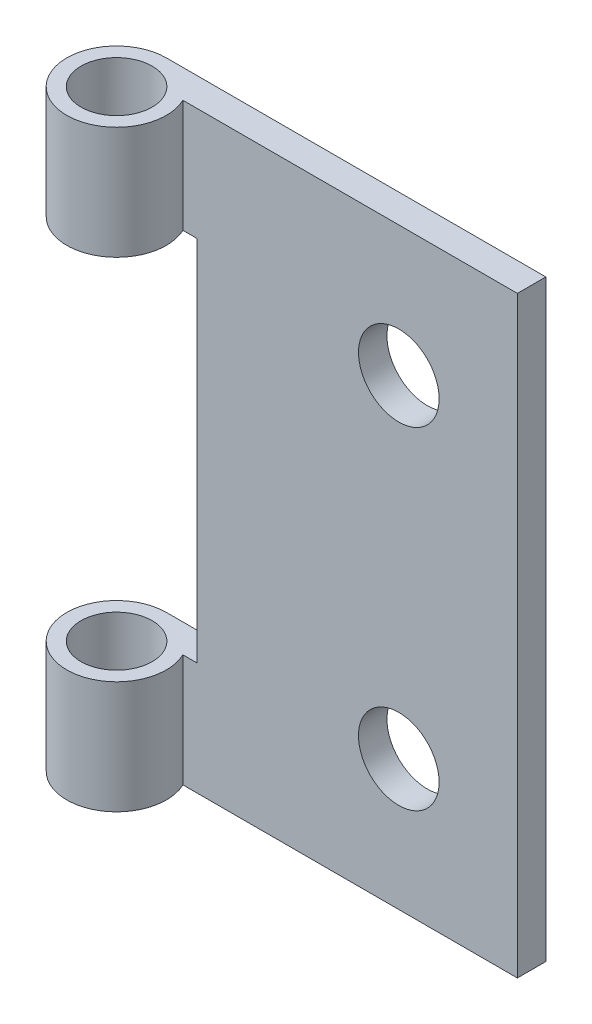
ISO-10303-21;
HEADER;
FILE_DESCRIPTION(('STEP AP214'),'2;1');
FILE_NAME('part.step','',(''),(''),'','','');
FILE_SCHEMA(('AUTOMOTIVE_DESIGN { 1 0 10303 214 1 1 1 1 }'));
ENDSEC;
DATA;
#1=APPLICATION_CONTEXT('core data for automotive mechanical design processes');
#2=APPLICATION_PROTOCOL_DEFINITION('international standard','automotive_design',2000,#1);
#3=PRODUCT_CONTEXT('',#1,'mechanical');
#4=PRODUCT('Part','Part','',(#3));
#5=PRODUCT_RELATED_PRODUCT_CATEGORY('part','',(#4));
#6=PRODUCT_DEFINITION_FORMATION('','',#4);
#7=PRODUCT_DEFINITION_CONTEXT('part definition',#1,'design');
#8=PRODUCT_DEFINITION('design','',#6,#7);
#9=PRODUCT_DEFINITION_SHAPE('','',#8);
#10=(LENGTH_UNIT() NAMED_UNIT(*) SI_UNIT(.MILLI.,.METRE.));
#11=(NAMED_UNIT(*) PLANE_ANGLE_UNIT() SI_UNIT($,.RADIAN.));
#12=(NAMED_UNIT(*) SI_UNIT($,.STERADIAN.) SOLID_ANGLE_UNIT());
#13=UNCERTAINTY_MEASURE_WITH_UNIT(LENGTH_MEASURE(1.E-05),#10,'distance_accuracy_value','');
#14=(GEOMETRIC_REPRESENTATION_CONTEXT(3) GLOBAL_UNCERTAINTY_ASSIGNED_CONTEXT((#13)) GLOBAL_UNIT_ASSIGNED_CONTEXT((#10,
#11,#12)) REPRESENTATION_CONTEXT('',''));
#15=CARTESIAN_POINT('',(0.,0.,0.));
#16=DIRECTION('',(0.,0.,1.));
#17=DIRECTION('',(1.,0.,0.));
#18=AXIS2_PLACEMENT_3D('',#15,#16,#17);
#19=CARTESIAN_POINT('',(-2.5,12.5,2.1));
#20=DIRECTION('',(0.,-1.,0.));
#21=DIRECTION('',(0.,0.,-1.));
#22=AXIS2_PLACEMENT_3D('',#19,#20,#21);
#23=CYLINDRICAL_SURFACE('',#22,2.1);
#24=CARTESIAN_POINT('',(-2.5,-7.75,2.1));
#25=DIRECTION('',(0.,-1.,0.));
#26=DIRECTION('',(1.,0.,0.));
#27=AXIS2_PLACEMENT_3D('',#24,#25,#26);
#28=CIRCLE('',#27,2.1);
#29=CARTESIAN_POINT('',(-2.5,-7.75,0.));
#30=VERTEX_POINT('',#29);
#31=CARTESIAN_POINT('',(-0.602633403898972,-7.75,1.2));
#32=VERTEX_POINT('',#31);
#33=EDGE_CURVE('E245',#30,#32,#28,.F.);
#34=ORIENTED_EDGE('',*,*,#33,.F.);
#35=DIRECTION('',(0.,1.,0.));
#36=VECTOR('',#35,1.);
#37=CARTESIAN_POINT('',(-2.5,-12.5,0.));
#38=LINE('',#37,#36);
#39=CARTESIAN_POINT('',(-2.5,-12.5,0.));
#40=VERTEX_POINT('',#39);
#41=EDGE_CURVE('E175',#40,#30,#38,.T.);
#42=ORIENTED_EDGE('',*,*,#41,.F.);
#43=CARTESIAN_POINT('',(-2.5,-12.5,2.1));
#44=DIRECTION('',(0.,-1.,0.));
#45=DIRECTION('',(0.,0.,-1.));
#46=AXIS2_PLACEMENT_3D('',#43,#44,#45);
#47=CIRCLE('',#46,2.1);
#48=CARTESIAN_POINT('',(-0.602633403898972,-12.5,1.2));
#49=VERTEX_POINT('',#48);
#50=EDGE_CURVE('E255',#49,#40,#47,.T.);
#51=ORIENTED_EDGE('',*,*,#50,.F.);
#52=DIRECTION('',(0.,-1.,0.));
#53=VECTOR('',#52,1.);
#54=CARTESIAN_POINT('',(-0.602633403898972,12.5,1.2));
#55=LINE('',#54,#53);
#56=EDGE_CURVE('E258',#49,#32,#55,.F.);
#57=ORIENTED_EDGE('',*,*,#56,.T.);
#58=EDGE_LOOP('',(#34,#42,#51,#57));
#59=FACE_BOUND('',#58,.T.);
#60=ADVANCED_FACE('F66',(#59),#23,.T.);
#61=CARTESIAN_POINT('',(-2.5,12.5,2.1));
#62=DIRECTION('',(0.,-1.,0.));
#63=DIRECTION('',(0.,0.,-1.));
#64=AXIS2_PLACEMENT_3D('',#61,#62,#63);
#65=CYLINDRICAL_SURFACE('',#64,1.5);
#66=CARTESIAN_POINT('',(-2.5,-7.75,2.1));
#67=DIRECTION('',(0.,-1.,0.));
#68=DIRECTION('',(1.,0.,0.));
#69=AXIS2_PLACEMENT_3D('',#66,#67,#68);
#70=CIRCLE('',#69,1.5);
#71=CARTESIAN_POINT('',(-0.999999999999999,-7.75,2.1));
#72=VERTEX_POINT('',#71);
#73=EDGE_CURVE('E70',#72,#72,#70,.F.);
#74=ORIENTED_EDGE('',*,*,#73,.T.);
#75=EDGE_LOOP('',(#74));
#76=FACE_BOUND('',#75,.T.);
#77=CARTESIAN_POINT('',(-2.5,-12.5,2.1));
#78=DIRECTION('',(0.,-1.,0.));
#79=DIRECTION('',(0.,0.,-1.));
#80=AXIS2_PLACEMENT_3D('',#77,#78,#79);
#81=CIRCLE('',#80,1.5);
#82=CARTESIAN_POINT('',(-2.5,-12.5,0.6));
#83=VERTEX_POINT('',#82);
#84=EDGE_CURVE('E246',#83,#83,#81,.T.);
#85=ORIENTED_EDGE('',*,*,#84,.T.);
#86=EDGE_LOOP('',(#85));
#87=FACE_BOUND('',#86,.T.);
#88=ADVANCED_FACE('F202',(#76,#87),#65,.F.);
#89=CARTESIAN_POINT('',(0.,0.,1.2));
#90=DIRECTION('',(1.,0.,0.));
#91=DIRECTION('',(0.,1.,0.));
#92=AXIS2_PLACEMENT_3D('',#89,#90,#91);
#93=PLANE('',#92);
#94=DIRECTION('',(0.,0.,-1.));
#95=VECTOR('',#94,1.);
#96=CARTESIAN_POINT('',(0.,-7.75,1.2));
#97=LINE('',#96,#95);
#98=CARTESIAN_POINT('',(0.,-7.75,1.2));
#99=VERTEX_POINT('',#98);
#100=CARTESIAN_POINT('',(0.,-7.75,0.));
#101=VERTEX_POINT('',#100);
#102=EDGE_CURVE('E12',#99,#101,#97,.T.);
#103=ORIENTED_EDGE('',*,*,#102,.F.);
#104=DIRECTION('',(0.,-1.,0.));
#105=VECTOR('',#104,1.);
#106=CARTESIAN_POINT('',(0.,0.,1.2));
#107=LINE('',#106,#105);
#108=CARTESIAN_POINT('',(0.,7.75,1.2));
#109=VERTEX_POINT('',#108);
#110=EDGE_CURVE('E277',#109,#99,#107,.T.);
#111=ORIENTED_EDGE('',*,*,#110,.F.);
#112=DIRECTION('',(0.,0.,-1.));
#113=VECTOR('',#112,1.);
#114=CARTESIAN_POINT('',(0.,7.75,1.2));
#115=LINE('',#114,#113);
#116=CARTESIAN_POINT('',(0.,7.75,0.));
#117=VERTEX_POINT('',#116);
#118=EDGE_CURVE('E168',#109,#117,#115,.T.);
#119=ORIENTED_EDGE('',*,*,#118,.T.);
#120=DIRECTION('',(0.,-1.,0.));
#121=VECTOR('',#120,1.);
#122=CARTESIAN_POINT('',(0.,0.,0.));
#123=LINE('',#122,#121);
#124=EDGE_CURVE('E149',#117,#101,#123,.T.);
#125=ORIENTED_EDGE('',*,*,#124,.T.);
#126=EDGE_LOOP('',(#103,#111,#119,#125));
#127=FACE_BOUND('',#126,.T.);
#128=ADVANCED_FACE('F208',(#127),#93,.F.);
#129=CARTESIAN_POINT('',(13.5,0.,1.2));
#130=DIRECTION('',(1.,0.,0.));
#131=DIRECTION('',(0.,1.,0.));
#132=AXIS2_PLACEMENT_3D('',#129,#130,#131);
#133=PLANE('',#132);
#134=DIRECTION('',(0.,-1.,0.));
#135=VECTOR('',#134,1.);
#136=CARTESIAN_POINT('',(13.5,0.,0.));
#137=LINE('',#136,#135);
#138=CARTESIAN_POINT('',(13.5,12.5,0.));
#139=VERTEX_POINT('',#138);
#140=CARTESIAN_POINT('',(13.5,-12.5,0.));
#141=VERTEX_POINT('',#140);
#142=EDGE_CURVE('E157',#139,#141,#137,.T.);
#143=ORIENTED_EDGE('',*,*,#142,.F.);
#144=DIRECTION('',(0.,0.,-1.));
#145=VECTOR('',#144,1.);
#146=CARTESIAN_POINT('',(13.5,12.5,1.2));
#147=LINE('',#146,#145);
#148=CARTESIAN_POINT('',(13.5,12.5,1.2));
#149=VERTEX_POINT('',#148);
#150=EDGE_CURVE('E75',#149,#139,#147,.T.);
#151=ORIENTED_EDGE('',*,*,#150,.F.);
#152=DIRECTION('',(0.,-1.,0.));
#153=VECTOR('',#152,1.);
#154=CARTESIAN_POINT('',(13.5,0.,1.2));
#155=LINE('',#154,#153);
#156=CARTESIAN_POINT('',(13.5,-12.5,1.2));
#157=VERTEX_POINT('',#156);
#158=EDGE_CURVE('E165',#149,#157,#155,.T.);
#159=ORIENTED_EDGE('',*,*,#158,.T.);
#160=DIRECTION('',(0.,0.,-1.));
#161=VECTOR('',#160,1.);
#162=CARTESIAN_POINT('',(13.5,-12.5,1.2));
#163=LINE('',#162,#161);
#164=EDGE_CURVE('E166',#157,#141,#163,.T.);
#165=ORIENTED_EDGE('',*,*,#164,.T.);
#166=EDGE_LOOP('',(#143,#151,#159,#165));
#167=FACE_BOUND('',#166,.T.);
#168=ADVANCED_FACE('F197',(#167),#133,.T.);
#169=CARTESIAN_POINT('',(0.,12.5,1.2));
#170=DIRECTION('',(0.,1.,0.));
#171=DIRECTION('',(-1.,0.,0.));
#172=AXIS2_PLACEMENT_3D('',#169,#170,#171);
#173=PLANE('',#172);
#174=CARTESIAN_POINT('',(-2.5,12.5,2.1));
#175=DIRECTION('',(0.,-1.,0.));
#176=DIRECTION('',(0.,0.,-1.));
#177=AXIS2_PLACEMENT_3D('',#174,#175,#176);
#178=CIRCLE('',#177,1.5);
#179=CARTESIAN_POINT('',(-2.5,12.5,0.6));
#180=VERTEX_POINT('',#179);
#181=EDGE_CURVE('E251',#180,#180,#178,.T.);
#182=ORIENTED_EDGE('',*,*,#181,.T.);
#183=EDGE_LOOP('',(#182));
#184=FACE_BOUND('',#183,.T.);
#185=DIRECTION('',(1.,0.,0.));
#186=VECTOR('',#185,1.);
#187=CARTESIAN_POINT('',(0.,12.5,0.));
#188=LINE('',#187,#186);
#189=CARTESIAN_POINT('',(-2.5,12.5,0.));
#190=VERTEX_POINT('',#189);
#191=EDGE_CURVE('E155',#190,#139,#188,.T.);
#192=ORIENTED_EDGE('',*,*,#191,.F.);
#193=CARTESIAN_POINT('',(-2.5,12.5,2.1));
#194=DIRECTION('',(0.,-1.,0.));
#195=DIRECTION('',(0.,0.,-1.));
#196=AXIS2_PLACEMENT_3D('',#193,#194,#195);
#197=CIRCLE('',#196,2.1);
#198=CARTESIAN_POINT('',(-0.602633403898972,12.5,1.2));
#199=VERTEX_POINT('',#198);
#200=EDGE_CURVE('E154',#199,#190,#197,.T.);
#201=ORIENTED_EDGE('',*,*,#200,.F.);
#202=DIRECTION('',(1.,0.,0.));
#203=VECTOR('',#202,1.);
#204=CARTESIAN_POINT('',(0.,12.5,1.2));
#205=LINE('',#204,#203);
#206=EDGE_CURVE('E90',#199,#149,#205,.T.);
#207=ORIENTED_EDGE('',*,*,#206,.T.);
#208=ORIENTED_EDGE('',*,*,#150,.T.);
#209=EDGE_LOOP('',(#192,#201,#207,#208));
#210=FACE_BOUND('',#209,.T.);
#211=ADVANCED_FACE('F188',(#184,#210),#173,.T.);
#212=CARTESIAN_POINT('',(0.,7.75,1.2));
#213=DIRECTION('',(0.,-1.,0.));
#214=DIRECTION('',(1.,0.,0.));
#215=AXIS2_PLACEMENT_3D('',#212,#213,#214);
#216=PLANE('',#215);
#217=DIRECTION('',(-1.,0.,0.));
#218=VECTOR('',#217,1.);
#219=CARTESIAN_POINT('',(0.,7.75,1.2));
#220=LINE('',#219,#218);
#221=CARTESIAN_POINT('',(-0.602633403898972,7.75,1.2));
#222=VERTEX_POINT('',#221);
#223=EDGE_CURVE('E137',#109,#222,#220,.T.);
#224=ORIENTED_EDGE('',*,*,#223,.T.);
#225=CARTESIAN_POINT('',(-2.5,7.75,2.1));
#226=DIRECTION('',(0.,1.,0.));
#227=DIRECTION('',(-1.,0.,0.));
#228=AXIS2_PLACEMENT_3D('',#225,#226,#227);
#229=CIRCLE('',#228,2.1);
#230=CARTESIAN_POINT('',(-2.5,7.75,0.));
#231=VERTEX_POINT('',#230);
#232=EDGE_CURVE('E83',#222,#231,#229,.F.);
#233=ORIENTED_EDGE('',*,*,#232,.T.);
#234=DIRECTION('',(-1.,0.,0.));
#235=VECTOR('',#234,1.);
#236=CARTESIAN_POINT('',(0.,7.75,0.));
#237=LINE('',#236,#235);
#238=EDGE_CURVE('E135',#117,#231,#237,.T.);
#239=ORIENTED_EDGE('',*,*,#238,.F.);
#240=ORIENTED_EDGE('',*,*,#118,.F.);
#241=EDGE_LOOP('',(#224,#233,#239,#240));
#242=FACE_BOUND('',#241,.T.);
#243=CARTESIAN_POINT('',(-2.5,7.75,2.1));
#244=DIRECTION('',(0.,1.,0.));
#245=DIRECTION('',(-1.,0.,0.));
#246=AXIS2_PLACEMENT_3D('',#243,#244,#245);
#247=CIRCLE('',#246,1.5);
#248=CARTESIAN_POINT('',(-4.,7.75,2.1));
#249=VERTEX_POINT('',#248);
#250=EDGE_CURVE('E138',#249,#249,#247,.F.);
#251=ORIENTED_EDGE('',*,*,#250,.F.);
#252=EDGE_LOOP('',(#251));
#253=FACE_BOUND('',#252,.T.);
#254=ADVANCED_FACE('F133',(#242,#253),#216,.T.);
#255=CARTESIAN_POINT('',(0.,-12.5,1.2));
#256=DIRECTION('',(0.,1.,0.));
#257=DIRECTION('',(0.,0.,1.));
#258=AXIS2_PLACEMENT_3D('',#255,#256,#257);
#259=PLANE('',#258);
#260=ORIENTED_EDGE('',*,*,#84,.F.);
#261=EDGE_LOOP('',(#260));
#262=FACE_BOUND('',#261,.T.);
#263=DIRECTION('',(1.,0.,0.));
#264=VECTOR('',#263,1.);
#265=CARTESIAN_POINT('',(0.,-12.5,1.2));
#266=LINE('',#265,#264);
#267=EDGE_CURVE('E169',#49,#157,#266,.T.);
#268=ORIENTED_EDGE('',*,*,#267,.F.);
#269=ORIENTED_EDGE('',*,*,#50,.T.);
#270=DIRECTION('',(1.,0.,0.));
#271=VECTOR('',#270,1.);
#272=CARTESIAN_POINT('',(0.,-12.5,0.));
#273=LINE('',#272,#271);
#274=EDGE_CURVE('E162',#40,#141,#273,.T.);
#275=ORIENTED_EDGE('',*,*,#274,.T.);
#276=ORIENTED_EDGE('',*,*,#164,.F.);
#277=EDGE_LOOP('',(#268,#269,#275,#276));
#278=FACE_BOUND('',#277,.T.);
#279=ADVANCED_FACE('F187',(#262,#278),#259,.F.);
#280=CARTESIAN_POINT('',(0.,0.,1.2));
#281=DIRECTION('',(0.,0.,1.));
#282=DIRECTION('',(1.,0.,0.));
#283=AXIS2_PLACEMENT_3D('',#280,#281,#282);
#284=PLANE('',#283);
#285=ORIENTED_EDGE('',*,*,#56,.F.);
#286=ORIENTED_EDGE('',*,*,#267,.T.);
#287=ORIENTED_EDGE('',*,*,#158,.F.);
#288=ORIENTED_EDGE('',*,*,#206,.F.);
#289=EDGE_CURVE('E261',#222,#199,#55,.F.);
#290=ORIENTED_EDGE('',*,*,#289,.F.);
#291=ORIENTED_EDGE('',*,*,#223,.F.);
#292=ORIENTED_EDGE('',*,*,#110,.T.);
#293=DIRECTION('',(-1.,0.,0.));
#294=VECTOR('',#293,1.);
#295=CARTESIAN_POINT('',(0.,-7.75,1.2));
#296=LINE('',#295,#294);
#297=EDGE_CURVE('E172',#99,#32,#296,.T.);
#298=ORIENTED_EDGE('',*,*,#297,.T.);
#299=EDGE_LOOP('',(#285,#286,#287,#288,#290,#291,#292,#298));
#300=FACE_BOUND('',#299,.T.);
#301=CARTESIAN_POINT('',(8.5,7.,1.2));
#302=DIRECTION('',(0.,0.,1.));
#303=DIRECTION('',(1.,0.,0.));
#304=AXIS2_PLACEMENT_3D('',#301,#302,#303);
#305=CIRCLE('',#304,1.7);
#306=CARTESIAN_POINT('',(10.2,7.,1.2));
#307=VERTEX_POINT('',#306);
#308=EDGE_CURVE('E264',#307,#307,#305,.T.);
#309=ORIENTED_EDGE('',*,*,#308,.F.);
#310=EDGE_LOOP('',(#309));
#311=FACE_BOUND('',#310,.T.);
#312=CARTESIAN_POINT('',(8.5,-7.,1.2));
#313=DIRECTION('',(0.,0.,1.));
#314=DIRECTION('',(1.,0.,0.));
#315=AXIS2_PLACEMENT_3D('',#312,#313,#314);
#316=CIRCLE('',#315,1.7);
#317=CARTESIAN_POINT('',(10.2,-7.,1.2));
#318=VERTEX_POINT('',#317);
#319=EDGE_CURVE('E270',#318,#318,#316,.T.);
#320=ORIENTED_EDGE('',*,*,#319,.F.);
#321=EDGE_LOOP('',(#320));
#322=FACE_BOUND('',#321,.T.);
#323=ADVANCED_FACE('F194',(#300,#311,#322),#284,.T.);
#324=CARTESIAN_POINT('',(0.,0.,0.));
#325=DIRECTION('',(0.,0.,1.));
#326=DIRECTION('',(1.,0.,0.));
#327=AXIS2_PLACEMENT_3D('',#324,#325,#326);
#328=PLANE('',#327);
#329=CARTESIAN_POINT('',(8.5,7.,0.));
#330=DIRECTION('',(0.,0.,1.));
#331=DIRECTION('',(1.,0.,0.));
#332=AXIS2_PLACEMENT_3D('',#329,#330,#331);
#333=CIRCLE('',#332,1.7);
#334=CARTESIAN_POINT('',(10.2,7.,0.));
#335=VERTEX_POINT('',#334);
#336=EDGE_CURVE('E179',#335,#335,#333,.T.);
#337=ORIENTED_EDGE('',*,*,#336,.T.);
#338=EDGE_LOOP('',(#337));
#339=FACE_BOUND('',#338,.T.);
#340=CARTESIAN_POINT('',(8.5,-7.,0.));
#341=DIRECTION('',(0.,0.,1.));
#342=DIRECTION('',(1.,0.,0.));
#343=AXIS2_PLACEMENT_3D('',#340,#341,#342);
#344=CIRCLE('',#343,1.7);
#345=CARTESIAN_POINT('',(10.2,-7.,0.));
#346=VERTEX_POINT('',#345);
#347=EDGE_CURVE('E267',#346,#346,#344,.T.);
#348=ORIENTED_EDGE('',*,*,#347,.T.);
#349=EDGE_LOOP('',(#348));
#350=FACE_BOUND('',#349,.T.);
#351=ORIENTED_EDGE('',*,*,#142,.T.);
#352=ORIENTED_EDGE('',*,*,#274,.F.);
#353=ORIENTED_EDGE('',*,*,#41,.T.);
#354=DIRECTION('',(-1.,0.,0.));
#355=VECTOR('',#354,1.);
#356=CARTESIAN_POINT('',(0.,-7.75,0.));
#357=LINE('',#356,#355);
#358=EDGE_CURVE('E176',#101,#30,#357,.T.);
#359=ORIENTED_EDGE('',*,*,#358,.F.);
#360=ORIENTED_EDGE('',*,*,#124,.F.);
#361=ORIENTED_EDGE('',*,*,#238,.T.);
#362=DIRECTION('',(0.,-1.,0.));
#363=VECTOR('',#362,1.);
#364=CARTESIAN_POINT('',(-2.5,0.,0.));
#365=LINE('',#364,#363);
#366=EDGE_CURVE('E145',#190,#231,#365,.T.);
#367=ORIENTED_EDGE('',*,*,#366,.F.);
#368=ORIENTED_EDGE('',*,*,#191,.T.);
#369=EDGE_LOOP('',(#351,#352,#353,#359,#360,#361,#367,#368));
#370=FACE_BOUND('',#369,.T.);
#371=ADVANCED_FACE('F143',(#339,#350,#370),#328,.F.);
#372=CARTESIAN_POINT('',(0.,-7.75,1.2));
#373=DIRECTION('',(0.,-1.,0.));
#374=DIRECTION('',(1.,0.,0.));
#375=AXIS2_PLACEMENT_3D('',#372,#373,#374);
#376=PLANE('',#375);
#377=ORIENTED_EDGE('',*,*,#358,.T.);
#378=ORIENTED_EDGE('',*,*,#33,.T.);
#379=ORIENTED_EDGE('',*,*,#297,.F.);
#380=ORIENTED_EDGE('',*,*,#102,.T.);
#381=EDGE_LOOP('',(#377,#378,#379,#380));
#382=FACE_BOUND('',#381,.T.);
#383=ORIENTED_EDGE('',*,*,#73,.F.);
#384=EDGE_LOOP('',(#383));
#385=FACE_BOUND('',#384,.T.);
#386=ADVANCED_FACE('F68',(#382,#385),#376,.F.);
#387=CARTESIAN_POINT('',(8.5,-7.,0.));
#388=DIRECTION('',(0.,0.,1.));
#389=DIRECTION('',(1.,0.,0.));
#390=AXIS2_PLACEMENT_3D('',#387,#388,#389);
#391=CYLINDRICAL_SURFACE('',#390,1.7);
#392=ORIENTED_EDGE('',*,*,#347,.F.);
#393=EDGE_LOOP('',(#392));
#394=FACE_BOUND('',#393,.T.);
#395=ORIENTED_EDGE('',*,*,#319,.T.);
#396=EDGE_LOOP('',(#395));
#397=FACE_BOUND('',#396,.T.);
#398=ADVANCED_FACE('F218',(#394,#397),#391,.F.);
#399=CARTESIAN_POINT('',(8.5,7.,0.));
#400=DIRECTION('',(0.,0.,1.));
#401=DIRECTION('',(1.,0.,0.));
#402=AXIS2_PLACEMENT_3D('',#399,#400,#401);
#403=CYLINDRICAL_SURFACE('',#402,1.7);
#404=ORIENTED_EDGE('',*,*,#336,.F.);
#405=EDGE_LOOP('',(#404));
#406=FACE_BOUND('',#405,.T.);
#407=ORIENTED_EDGE('',*,*,#308,.T.);
#408=EDGE_LOOP('',(#407));
#409=FACE_BOUND('',#408,.T.);
#410=ADVANCED_FACE('F213',(#406,#409),#403,.F.);
#411=ORIENTED_EDGE('',*,*,#232,.F.);
#412=ORIENTED_EDGE('',*,*,#289,.T.);
#413=ORIENTED_EDGE('',*,*,#200,.T.);
#414=ORIENTED_EDGE('',*,*,#366,.T.);
#415=EDGE_LOOP('',(#411,#412,#413,#414));
#416=FACE_BOUND('',#415,.T.);
#417=ADVANCED_FACE('F152',(#416),#23,.T.);
#418=ORIENTED_EDGE('',*,*,#250,.T.);
#419=EDGE_LOOP('',(#418));
#420=FACE_BOUND('',#419,.T.);
#421=ORIENTED_EDGE('',*,*,#181,.F.);
#422=EDGE_LOOP('',(#421));
#423=FACE_BOUND('',#422,.T.);
#424=ADVANCED_FACE('F184',(#420,#423),#65,.F.);
#425=CLOSED_SHELL('',(#60,#88,#128,#168,#211,#254,#279,#323,#371,#386,#398,#410,#417,#424));
#426=MANIFOLD_SOLID_BREP('B2',#425);
#427=ADVANCED_BREP_SHAPE_REPRESENTATION('',(#18,#426),#14);
#428=SHAPE_DEFINITION_REPRESENTATION(#9,#427);
ENDSEC;
END-ISO-10303-21;
